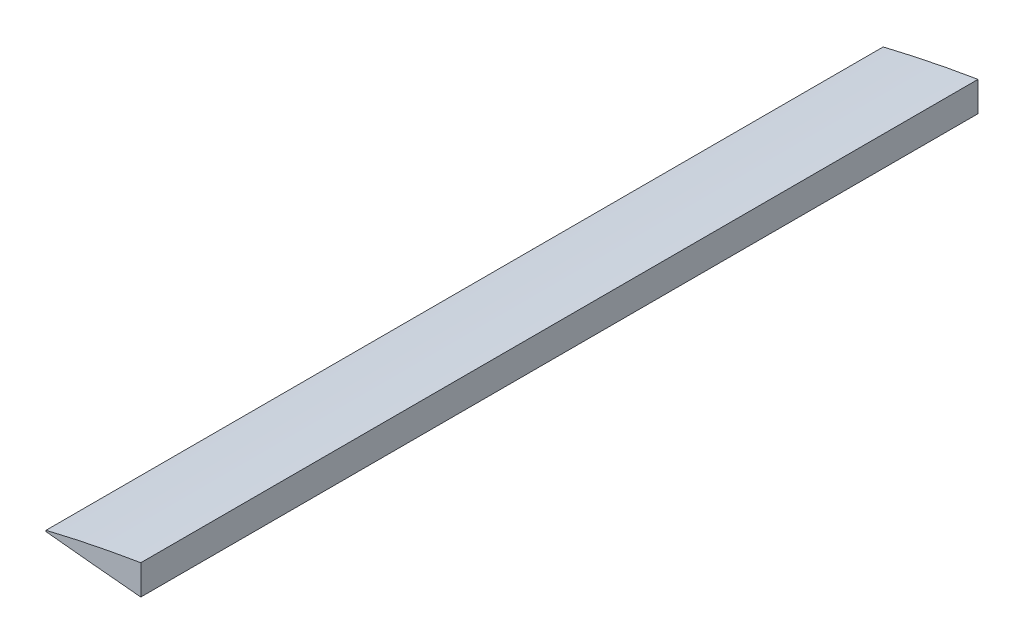
ISO-10303-21;
HEADER;
FILE_DESCRIPTION(('STEP AP214'),'2;1');
FILE_NAME('part.step','',(''),(''),'','','');
FILE_SCHEMA(('AUTOMOTIVE_DESIGN { 1 0 10303 214 1 1 1 1 }'));
ENDSEC;
DATA;
#1=APPLICATION_CONTEXT('core data for automotive mechanical design processes');
#2=APPLICATION_PROTOCOL_DEFINITION('international standard','automotive_design',2000,#1);
#3=PRODUCT_CONTEXT('',#1,'mechanical');
#4=PRODUCT('Part','Part','',(#3));
#5=PRODUCT_RELATED_PRODUCT_CATEGORY('part','',(#4));
#6=PRODUCT_DEFINITION_FORMATION('','',#4);
#7=PRODUCT_DEFINITION_CONTEXT('part definition',#1,'design');
#8=PRODUCT_DEFINITION('design','',#6,#7);
#9=PRODUCT_DEFINITION_SHAPE('','',#8);
#10=(LENGTH_UNIT() NAMED_UNIT(*) SI_UNIT(.MILLI.,.METRE.));
#11=(NAMED_UNIT(*) PLANE_ANGLE_UNIT() SI_UNIT($,.RADIAN.));
#12=(NAMED_UNIT(*) SI_UNIT($,.STERADIAN.) SOLID_ANGLE_UNIT());
#13=UNCERTAINTY_MEASURE_WITH_UNIT(LENGTH_MEASURE(1.E-05),#10,'distance_accuracy_value','');
#14=(GEOMETRIC_REPRESENTATION_CONTEXT(3) GLOBAL_UNCERTAINTY_ASSIGNED_CONTEXT((#13)) GLOBAL_UNIT_ASSIGNED_CONTEXT((#10,
#11,#12)) REPRESENTATION_CONTEXT('',''));
#15=CARTESIAN_POINT('',(0.,0.,0.));
#16=DIRECTION('',(0.,0.,1.));
#17=DIRECTION('',(1.,0.,0.));
#18=AXIS2_PLACEMENT_3D('',#15,#16,#17);
#19=CARTESIAN_POINT('',(-197.26698,14.5455563842117,612.));
#20=CARTESIAN_POINT('',(-199.291263309449,14.2098235608923,612.));
#21=CARTESIAN_POINT('',(-204.216747598756,13.3929187635522,612.));
#22=CARTESIAN_POINT('',(-211.867868305819,12.0299445619646,612.));
#23=CARTESIAN_POINT('',(-220.046716751411,10.5108577650669,612.));
#24=CARTESIAN_POINT('',(-227.684960433517,9.02419088101299,612.));
#25=CARTESIAN_POINT('',(-234.737637436739,7.59533686084731,612.));
#26=CARTESIAN_POINT('',(-241.162806840911,6.24495861444983,612.));
#27=CARTESIAN_POINT('',(-246.922671775962,4.99420998366507,612.));
#28=CARTESIAN_POINT('',(-251.983535286983,3.86307494473272,612.));
#29=CARTESIAN_POINT('',(-256.315994171342,2.87026933874093,612.));
#30=CARTESIAN_POINT('',(-259.895031114643,2.03269567934803,612.));
#31=CARTESIAN_POINT('',(-262.700108492801,1.3650391167586,612.));
#32=CARTESIAN_POINT('',(-264.715189951494,0.879184388013478,612.));
#33=CARTESIAN_POINT('',(-265.919534870809,0.58638033068329,612.));
#34=CARTESIAN_POINT('',(-266.45091941256,0.456553449180884,612.));
#35=CARTESIAN_POINT('',(-266.577,0.425749674890788,612.));
#36=B_SPLINE_CURVE_WITH_KNOTS('',3,(#19,#20,#21,#22,#23,#24,#25,#26,#27,#28,#29,#30,#31,#32,#33,
#34,#35),.UNSPECIFIED.,.F.,.F.,(4,1,1,1,1,1,1,1,1,1,1,1,1,1,4),(0.,0.0870070051452903,
0.21170536500617,0.329527112719374,0.439740644540536,0.541660709078569,0.634652346186561,
0.718134668905483,0.791584505134145,0.854539888493236,0.906603358473801,0.947445002011978,
0.976805146454737,0.994496601743554,1.),.UNSPECIFIED.);
#37=DIRECTION('',(0.,0.,-1.));
#38=VECTOR('',#37,1.);
#39=SURFACE_OF_LINEAR_EXTRUSION('',#36,#38);
#40=CARTESIAN_POINT('',(-197.26698,14.5455563842117,0.));
#41=CARTESIAN_POINT('',(-199.291263309449,14.2098235608923,0.));
#42=CARTESIAN_POINT('',(-204.216747598756,13.3929187635522,0.));
#43=CARTESIAN_POINT('',(-211.867868305819,12.0299445619646,0.));
#44=CARTESIAN_POINT('',(-220.046716751411,10.5108577650669,0.));
#45=CARTESIAN_POINT('',(-227.684960433517,9.02419088101299,0.));
#46=CARTESIAN_POINT('',(-234.737637436739,7.59533686084731,0.));
#47=CARTESIAN_POINT('',(-241.162806840911,6.24495861444983,0.));
#48=CARTESIAN_POINT('',(-246.922671775962,4.99420998366507,0.));
#49=CARTESIAN_POINT('',(-251.983535286983,3.86307494473272,0.));
#50=CARTESIAN_POINT('',(-256.315994171342,2.87026933874093,0.));
#51=CARTESIAN_POINT('',(-259.895031114643,2.03269567934803,0.));
#52=CARTESIAN_POINT('',(-262.700108492801,1.3650391167586,0.));
#53=CARTESIAN_POINT('',(-264.715189951494,0.879184388013478,0.));
#54=CARTESIAN_POINT('',(-265.919534870809,0.58638033068329,0.));
#55=CARTESIAN_POINT('',(-266.45091941256,0.456553449180884,0.));
#56=CARTESIAN_POINT('',(-266.577,0.425749674890788,0.));
#57=B_SPLINE_CURVE_WITH_KNOTS('',3,(#40,#41,#42,#43,#44,#45,#46,#47,#48,#49,#50,#51,#52,#53,#54,
#55,#56),.UNSPECIFIED.,.F.,.F.,(4,1,1,1,1,1,1,1,1,1,1,1,1,1,4),(0.,0.0870070051452903,
0.21170536500617,0.329527112719374,0.439740644540536,0.541660709078569,0.634652346186561,
0.718134668905483,0.791584505134145,0.854539888493236,0.906603358473801,0.947445002011978,
0.976805146454737,0.994496601743554,1.),.UNSPECIFIED.);
#58=CARTESIAN_POINT('',(-197.26698,14.5455563842117,0.));
#59=VERTEX_POINT('',#58);
#60=CARTESIAN_POINT('',(-266.577,0.425749674890788,0.));
#61=VERTEX_POINT('',#60);
#62=EDGE_CURVE('E134',#59,#61,#57,.T.);
#63=ORIENTED_EDGE('',*,*,#62,.T.);
#64=DIRECTION('',(0.,0.,-1.));
#65=VECTOR('',#64,1.);
#66=CARTESIAN_POINT('',(-266.577,0.425749674890788,612.));
#67=LINE('',#66,#65);
#68=CARTESIAN_POINT('',(-266.577,0.425749674890788,612.));
#69=VERTEX_POINT('',#68);
#70=EDGE_CURVE('E184',#69,#61,#67,.T.);
#71=ORIENTED_EDGE('',*,*,#70,.F.);
#72=CARTESIAN_POINT('',(-197.26698,14.5455563842117,612.));
#73=VERTEX_POINT('',#72);
#74=EDGE_CURVE('E147',#73,#69,#36,.T.);
#75=ORIENTED_EDGE('',*,*,#74,.F.);
#76=DIRECTION('',(0.,0.,-1.));
#77=VECTOR('',#76,1.);
#78=CARTESIAN_POINT('',(-197.26698,14.5455563842117,612.));
#79=LINE('',#78,#77);
#80=EDGE_CURVE('E204',#73,#59,#79,.T.);
#81=ORIENTED_EDGE('',*,*,#80,.T.);
#82=EDGE_LOOP('',(#63,#71,#75,#81));
#83=FACE_BOUND('',#82,.T.);
#84=ADVANCED_FACE('F39',(#83),#39,.F.);
#85=CARTESIAN_POINT('',(-266.577,0.425749674890788,612.));
#86=DIRECTION('',(1.,0.,0.));
#87=DIRECTION('',(0.,0.,-1.));
#88=AXIS2_PLACEMENT_3D('',#85,#86,#87);
#89=PLANE('',#88);
#90=DIRECTION('',(0.,-1.,0.));
#91=VECTOR('',#90,1.);
#92=CARTESIAN_POINT('',(-266.577,0.425749674890788,0.));
#93=LINE('',#92,#91);
#94=CARTESIAN_POINT('',(-266.577,-0.41892885409085,0.));
#95=VERTEX_POINT('',#94);
#96=EDGE_CURVE('E179',#61,#95,#93,.T.);
#97=ORIENTED_EDGE('',*,*,#96,.T.);
#98=DIRECTION('',(0.,0.,-1.));
#99=VECTOR('',#98,1.);
#100=CARTESIAN_POINT('',(-266.577,-0.41892885409085,612.));
#101=LINE('',#100,#99);
#102=CARTESIAN_POINT('',(-266.577,-0.41892885409085,612.));
#103=VERTEX_POINT('',#102);
#104=EDGE_CURVE('E181',#103,#95,#101,.T.);
#105=ORIENTED_EDGE('',*,*,#104,.F.);
#106=DIRECTION('',(0.,-1.,0.));
#107=VECTOR('',#106,1.);
#108=CARTESIAN_POINT('',(-266.577,0.425749674890788,612.));
#109=LINE('',#108,#107);
#110=EDGE_CURVE('E94',#69,#103,#109,.T.);
#111=ORIENTED_EDGE('',*,*,#110,.F.);
#112=ORIENTED_EDGE('',*,*,#70,.T.);
#113=EDGE_LOOP('',(#97,#105,#111,#112));
#114=FACE_BOUND('',#113,.T.);
#115=ADVANCED_FACE('F170',(#114),#89,.F.);
#116=CARTESIAN_POINT('',(-266.577,-0.41892885409085,612.));
#117=CARTESIAN_POINT('',(-266.567688700725,-0.418895711428767,612.));
#118=CARTESIAN_POINT('',(-266.419029815931,-0.418366574619933,612.));
#119=CARTESIAN_POINT('',(-265.858416095577,-0.512805200817322,612.));
#120=CARTESIAN_POINT('',(-264.615468630259,-0.612861211389642,612.));
#121=CARTESIAN_POINT('',(-262.556904408314,-0.849913682994218,612.));
#122=CARTESIAN_POINT('',(-259.69222092313,-1.14357574442184,612.));
#123=CARTESIAN_POINT('',(-256.042317783404,-1.52735930086127,612.));
#124=CARTESIAN_POINT('',(-251.630355083086,-1.98099836309341,612.));
#125=CARTESIAN_POINT('',(-246.485492990788,-2.50472176150919,612.));
#126=CARTESIAN_POINT('',(-240.641108588964,-3.09072516045395,612.));
#127=CARTESIAN_POINT('',(-234.135070336197,-3.73362628466857,612.));
#128=CARTESIAN_POINT('',(-227.009246774642,-4.42698979177177,612.));
#129=CARTESIAN_POINT('',(-219.309277241564,-5.16475841349066,612.));
#130=CARTESIAN_POINT('',(-211.084107985415,-5.93956686196069,612.));
#131=CARTESIAN_POINT('',(-203.67843919876,-6.62767429473458,612.));
#132=CARTESIAN_POINT('',(-199.019685081769,-7.05001759121365,612.));
#133=CARTESIAN_POINT('',(-197.26698,-7.20891055345223,612.));
#134=B_SPLINE_CURVE_WITH_KNOTS('',3,(#116,#117,#118,#119,#120,#121,#122,#123,#124,#125,#126,
#127,#128,#129,#130,#131,#132,#133),.UNSPECIFIED.,.F.,.F.,(4,1,1,1,1,1,1,1,1,1,1,1,1,1,1,4),(0.,
0.00040102700423772,0.00640256804801376,0.0243667405419054,0.0541726551316404,
0.0956203448841406,0.148432949269865,0.212259606924723,0.286678920603445,0.371202853061501,
0.465280924763119,0.568304609739684,0.67961185947699,0.798491720853711,0.924189047970984,1.),.UNSPECIFIED.);
#135=DIRECTION('',(0.,0.,-1.));
#136=VECTOR('',#135,1.);
#137=SURFACE_OF_LINEAR_EXTRUSION('',#134,#136);
#138=DIRECTION('',(0.,0.,-1.));
#139=VECTOR('',#138,1.);
#140=CARTESIAN_POINT('',(-220.432,-5.05582594113558,612.));
#141=LINE('',#140,#139);
#142=CARTESIAN_POINT('',(-220.432,-5.05582594161143,96.8999999999999));
#143=VERTEX_POINT('',#142);
#144=CARTESIAN_POINT('',(-220.431999995003,-5.05582594161143,83.8999999999999));
#145=VERTEX_POINT('',#144);
#146=EDGE_CURVE('E49',#143,#145,#141,.T.);
#147=ORIENTED_EDGE('',*,*,#146,.F.);
#148=CARTESIAN_POINT('',(-266.577,-0.41892885409085,96.9));
#149=CARTESIAN_POINT('',(-266.567688700725,-0.418895711428767,96.9));
#150=CARTESIAN_POINT('',(-266.419029815931,-0.418366574619933,96.9));
#151=CARTESIAN_POINT('',(-265.858416095577,-0.512805200817322,96.9));
#152=CARTESIAN_POINT('',(-264.615468630259,-0.612861211389642,96.9));
#153=CARTESIAN_POINT('',(-262.556904408314,-0.849913682994218,96.9));
#154=CARTESIAN_POINT('',(-259.69222092313,-1.14357574442184,96.9));
#155=CARTESIAN_POINT('',(-256.042317783404,-1.52735930086127,96.9));
#156=CARTESIAN_POINT('',(-251.630355083086,-1.98099836309341,96.9));
#157=CARTESIAN_POINT('',(-246.485492990788,-2.50472176150919,96.9));
#158=CARTESIAN_POINT('',(-240.641108588964,-3.09072516045395,96.9));
#159=CARTESIAN_POINT('',(-234.135070336197,-3.73362628466857,96.9));
#160=CARTESIAN_POINT('',(-227.009246774642,-4.42698979177177,96.9));
#161=CARTESIAN_POINT('',(-219.309277241564,-5.16475841349066,96.9));
#162=CARTESIAN_POINT('',(-211.084107985415,-5.93956686196069,96.9));
#163=CARTESIAN_POINT('',(-203.67843919876,-6.62767429473458,96.9));
#164=CARTESIAN_POINT('',(-199.019685081769,-7.05001759121365,96.9));
#165=CARTESIAN_POINT('',(-197.26698,-7.20891055345223,96.9));
#166=B_SPLINE_CURVE_WITH_KNOTS('',3,(#148,#149,#150,#151,#152,#153,#154,#155,#156,#157,#158,
#159,#160,#161,#162,#163,#164,#165),.UNSPECIFIED.,.F.,.F.,(4,1,1,1,1,1,1,1,1,1,1,1,1,1,1,4),(0.,
0.00040102700423772,0.00640256804801376,0.0243667405419054,0.0541726551316404,
0.0956203448841406,0.148432949269865,0.212259606924723,0.286678920603445,0.371202853061501,
0.465280924763119,0.568304609739684,0.67961185947699,0.798491720853711,0.924189047970984,1.),.UNSPECIFIED.);
#167=CARTESIAN_POINT('',(-199.432,-7.012534803575,96.8999999999999));
#168=VERTEX_POINT('',#167);
#169=EDGE_CURVE('E11',#143,#168,#166,.T.);
#170=ORIENTED_EDGE('',*,*,#169,.T.);
#171=DIRECTION('',(0.,0.,-1.));
#172=VECTOR('',#171,1.);
#173=CARTESIAN_POINT('',(-199.432,-7.012534803575,612.));
#174=LINE('',#173,#172);
#175=CARTESIAN_POINT('',(-199.432,-7.012534803575,83.8999999999999));
#176=VERTEX_POINT('',#175);
#177=EDGE_CURVE('E123',#176,#168,#174,.F.);
#178=ORIENTED_EDGE('',*,*,#177,.F.);
#179=CARTESIAN_POINT('',(-266.577,-0.41892885409085,83.8999999999999));
#180=CARTESIAN_POINT('',(-266.567688700725,-0.418895711428767,83.8999999999999));
#181=CARTESIAN_POINT('',(-266.419029815931,-0.418366574619933,83.8999999999999));
#182=CARTESIAN_POINT('',(-265.858416095577,-0.512805200817322,83.8999999999999));
#183=CARTESIAN_POINT('',(-264.615468630259,-0.612861211389642,83.8999999999999));
#184=CARTESIAN_POINT('',(-262.556904408314,-0.849913682994218,83.8999999999999));
#185=CARTESIAN_POINT('',(-259.69222092313,-1.14357574442184,83.8999999999999));
#186=CARTESIAN_POINT('',(-256.042317783404,-1.52735930086127,83.8999999999999));
#187=CARTESIAN_POINT('',(-251.630355083086,-1.98099836309341,83.8999999999999));
#188=CARTESIAN_POINT('',(-246.485492990788,-2.50472176150919,83.8999999999999));
#189=CARTESIAN_POINT('',(-240.641108588964,-3.09072516045395,83.8999999999999));
#190=CARTESIAN_POINT('',(-234.135070336197,-3.73362628466857,83.8999999999999));
#191=CARTESIAN_POINT('',(-227.009246774642,-4.42698979177177,83.8999999999999));
#192=CARTESIAN_POINT('',(-219.309277241564,-5.16475841349066,83.8999999999999));
#193=CARTESIAN_POINT('',(-211.084107985415,-5.93956686196069,83.8999999999999));
#194=CARTESIAN_POINT('',(-203.67843919876,-6.62767429473458,83.8999999999999));
#195=CARTESIAN_POINT('',(-199.019685081769,-7.05001759121365,83.8999999999999));
#196=CARTESIAN_POINT('',(-197.26698,-7.20891055345223,83.8999999999999));
#197=B_SPLINE_CURVE_WITH_KNOTS('',3,(#179,#180,#181,#182,#183,#184,#185,#186,#187,#188,#189,
#190,#191,#192,#193,#194,#195,#196),.UNSPECIFIED.,.F.,.F.,(4,1,1,1,1,1,1,1,1,1,1,1,1,1,1,4),(0.,
0.00040102700423772,0.00640256804801376,0.0243667405419054,0.0541726551316404,
0.0956203448841406,0.148432949269865,0.212259606924723,0.286678920603445,0.371202853061501,
0.465280924763119,0.568304609739684,0.67961185947699,0.798491720853711,0.924189047970984,1.),.UNSPECIFIED.);
#198=EDGE_CURVE('E208',#145,#176,#197,.T.);
#199=ORIENTED_EDGE('',*,*,#198,.F.);
#200=EDGE_LOOP('',(#147,#170,#178,#199));
#201=FACE_BOUND('',#200,.T.);
#202=CARTESIAN_POINT('',(-266.577,-0.41892885409085,0.));
#203=CARTESIAN_POINT('',(-266.567688700725,-0.418895711428767,0.));
#204=CARTESIAN_POINT('',(-266.419029815931,-0.418366574619933,0.));
#205=CARTESIAN_POINT('',(-265.858416095577,-0.512805200817322,0.));
#206=CARTESIAN_POINT('',(-264.615468630259,-0.612861211389642,0.));
#207=CARTESIAN_POINT('',(-262.556904408314,-0.849913682994218,0.));
#208=CARTESIAN_POINT('',(-259.69222092313,-1.14357574442184,0.));
#209=CARTESIAN_POINT('',(-256.042317783404,-1.52735930086127,0.));
#210=CARTESIAN_POINT('',(-251.630355083086,-1.98099836309341,0.));
#211=CARTESIAN_POINT('',(-246.485492990788,-2.50472176150919,0.));
#212=CARTESIAN_POINT('',(-240.641108588964,-3.09072516045395,0.));
#213=CARTESIAN_POINT('',(-234.135070336197,-3.73362628466857,0.));
#214=CARTESIAN_POINT('',(-227.009246774642,-4.42698979177177,0.));
#215=CARTESIAN_POINT('',(-219.309277241564,-5.16475841349066,0.));
#216=CARTESIAN_POINT('',(-211.084107985415,-5.93956686196069,0.));
#217=CARTESIAN_POINT('',(-203.67843919876,-6.62767429473458,0.));
#218=CARTESIAN_POINT('',(-199.019685081769,-7.05001759121365,0.));
#219=CARTESIAN_POINT('',(-197.26698,-7.20891055345223,0.));
#220=B_SPLINE_CURVE_WITH_KNOTS('',3,(#202,#203,#204,#205,#206,#207,#208,#209,#210,#211,#212,
#213,#214,#215,#216,#217,#218,#219),.UNSPECIFIED.,.F.,.F.,(4,1,1,1,1,1,1,1,1,1,1,1,1,1,1,4),(0.,
0.00040102700423772,0.00640256804801376,0.0243667405419054,0.0541726551316404,
0.0956203448841406,0.148432949269865,0.212259606924723,0.286678920603445,0.371202853061501,
0.465280924763119,0.568304609739684,0.67961185947699,0.798491720853711,0.924189047970984,1.),.UNSPECIFIED.);
#221=CARTESIAN_POINT('',(-197.26698,-7.20891055345223,0.));
#222=VERTEX_POINT('',#221);
#223=EDGE_CURVE('E189',#95,#222,#220,.T.);
#224=ORIENTED_EDGE('',*,*,#223,.T.);
#225=DIRECTION('',(0.,0.,-1.));
#226=VECTOR('',#225,1.);
#227=CARTESIAN_POINT('',(-197.26698,-7.20891055345223,612.));
#228=LINE('',#227,#226);
#229=CARTESIAN_POINT('',(-197.26698,-7.20891055345223,612.));
#230=VERTEX_POINT('',#229);
#231=EDGE_CURVE('E193',#230,#222,#228,.T.);
#232=ORIENTED_EDGE('',*,*,#231,.F.);
#233=EDGE_CURVE('E156',#103,#230,#134,.T.);
#234=ORIENTED_EDGE('',*,*,#233,.F.);
#235=ORIENTED_EDGE('',*,*,#104,.T.);
#236=EDGE_LOOP('',(#224,#232,#234,#235));
#237=FACE_BOUND('',#236,.T.);
#238=ADVANCED_FACE('F166',(#201,#237),#137,.F.);
#239=CARTESIAN_POINT('',(-197.26698,14.5455563842117,612.));
#240=DIRECTION('',(-1.,0.,0.));
#241=DIRECTION('',(0.,0.,1.));
#242=AXIS2_PLACEMENT_3D('',#239,#240,#241);
#243=PLANE('',#242);
#244=DIRECTION('',(0.,1.,0.));
#245=VECTOR('',#244,1.);
#246=CARTESIAN_POINT('',(-197.26698,14.5455563842117,0.));
#247=LINE('',#246,#245);
#248=EDGE_CURVE('E86',#222,#59,#247,.T.);
#249=ORIENTED_EDGE('',*,*,#248,.T.);
#250=ORIENTED_EDGE('',*,*,#80,.F.);
#251=DIRECTION('',(0.,1.,0.));
#252=VECTOR('',#251,1.);
#253=CARTESIAN_POINT('',(-197.26698,14.5455563842117,612.));
#254=LINE('',#253,#252);
#255=EDGE_CURVE('E65',#230,#73,#254,.T.);
#256=ORIENTED_EDGE('',*,*,#255,.F.);
#257=ORIENTED_EDGE('',*,*,#231,.T.);
#258=EDGE_LOOP('',(#249,#250,#256,#257));
#259=FACE_BOUND('',#258,.T.);
#260=ADVANCED_FACE('F169',(#259),#243,.F.);
#261=CARTESIAN_POINT('',(-232.054668049981,8.13635792978354,612.));
#262=DIRECTION('',(0.,0.,-1.));
#263=DIRECTION('',(-1.,0.,0.));
#264=AXIS2_PLACEMENT_3D('',#261,#262,#263);
#265=PLANE('',#264);
#266=ORIENTED_EDGE('',*,*,#74,.T.);
#267=ORIENTED_EDGE('',*,*,#110,.T.);
#268=ORIENTED_EDGE('',*,*,#233,.T.);
#269=ORIENTED_EDGE('',*,*,#255,.T.);
#270=EDGE_LOOP('',(#266,#267,#268,#269));
#271=FACE_BOUND('',#270,.T.);
#272=ADVANCED_FACE('F233',(#271),#265,.F.);
#273=CARTESIAN_POINT('',(-232.054668049981,8.13635792978354,0.));
#274=DIRECTION('',(0.,0.,-1.));
#275=DIRECTION('',(-1.,0.,0.));
#276=AXIS2_PLACEMENT_3D('',#273,#274,#275);
#277=PLANE('',#276);
#278=ORIENTED_EDGE('',*,*,#62,.F.);
#279=ORIENTED_EDGE('',*,*,#248,.F.);
#280=ORIENTED_EDGE('',*,*,#223,.F.);
#281=ORIENTED_EDGE('',*,*,#96,.F.);
#282=EDGE_LOOP('',(#278,#279,#280,#281));
#283=FACE_BOUND('',#282,.T.);
#284=ADVANCED_FACE('F195',(#283),#277,.T.);
#285=CARTESIAN_POINT('',(-220.432,3.723,96.8999999999999));
#286=DIRECTION('',(1.,0.,0.));
#287=DIRECTION('',(0.,0.,-1.));
#288=AXIS2_PLACEMENT_3D('',#285,#286,#287);
#289=PLANE('',#288);
#290=ORIENTED_EDGE('',*,*,#146,.T.);
#291=DIRECTION('',(0.,-1.,0.));
#292=VECTOR('',#291,1.);
#293=CARTESIAN_POINT('',(-220.432,3.723,83.8999999999999));
#294=LINE('',#293,#292);
#295=CARTESIAN_POINT('',(-220.432,3.723,83.8999999999999));
#296=VERTEX_POINT('',#295);
#297=EDGE_CURVE('E56',#296,#145,#294,.T.);
#298=ORIENTED_EDGE('',*,*,#297,.F.);
#299=DIRECTION('',(0.,0.,-1.));
#300=VECTOR('',#299,1.);
#301=CARTESIAN_POINT('',(-220.432,3.723,96.8999999999999));
#302=LINE('',#301,#300);
#303=CARTESIAN_POINT('',(-220.432,3.723,96.8999999999999));
#304=VERTEX_POINT('',#303);
#305=EDGE_CURVE('E135',#304,#296,#302,.T.);
#306=ORIENTED_EDGE('',*,*,#305,.F.);
#307=DIRECTION('',(0.,-1.,0.));
#308=VECTOR('',#307,1.);
#309=CARTESIAN_POINT('',(-220.432,3.723,96.8999999999999));
#310=LINE('',#309,#308);
#311=EDGE_CURVE('E127',#304,#143,#310,.T.);
#312=ORIENTED_EDGE('',*,*,#311,.T.);
#313=EDGE_LOOP('',(#290,#298,#306,#312));
#314=FACE_BOUND('',#313,.T.);
#315=ADVANCED_FACE('F218',(#314),#289,.T.);
#316=CARTESIAN_POINT('',(-199.432,-7.777,96.8999999999999));
#317=DIRECTION('',(-1.,0.,0.));
#318=DIRECTION('',(0.,0.,1.));
#319=AXIS2_PLACEMENT_3D('',#316,#317,#318);
#320=PLANE('',#319);
#321=ORIENTED_EDGE('',*,*,#177,.T.);
#322=DIRECTION('',(0.,1.,0.));
#323=VECTOR('',#322,1.);
#324=CARTESIAN_POINT('',(-199.432,-7.777,96.8999999999999));
#325=LINE('',#324,#323);
#326=CARTESIAN_POINT('',(-199.432,3.723,96.8999999999999));
#327=VERTEX_POINT('',#326);
#328=EDGE_CURVE('E116',#168,#327,#325,.T.);
#329=ORIENTED_EDGE('',*,*,#328,.T.);
#330=DIRECTION('',(0.,0.,-1.));
#331=VECTOR('',#330,1.);
#332=CARTESIAN_POINT('',(-199.432,3.723,96.8999999999999));
#333=LINE('',#332,#331);
#334=CARTESIAN_POINT('',(-199.432,3.723,83.8999999999999));
#335=VERTEX_POINT('',#334);
#336=EDGE_CURVE('E120',#327,#335,#333,.T.);
#337=ORIENTED_EDGE('',*,*,#336,.T.);
#338=DIRECTION('',(0.,1.,0.));
#339=VECTOR('',#338,1.);
#340=CARTESIAN_POINT('',(-199.432,-7.777,83.8999999999999));
#341=LINE('',#340,#339);
#342=EDGE_CURVE('E145',#176,#335,#341,.T.);
#343=ORIENTED_EDGE('',*,*,#342,.F.);
#344=EDGE_LOOP('',(#321,#329,#337,#343));
#345=FACE_BOUND('',#344,.T.);
#346=ADVANCED_FACE('F118',(#345),#320,.T.);
#347=CARTESIAN_POINT('',(0.,0.,96.8999999999999));
#348=DIRECTION('',(0.,0.,1.));
#349=DIRECTION('',(1.,0.,0.));
#350=AXIS2_PLACEMENT_3D('',#347,#348,#349);
#351=PLANE('',#350);
#352=ORIENTED_EDGE('',*,*,#311,.F.);
#353=DIRECTION('',(-1.,0.,0.));
#354=VECTOR('',#353,1.);
#355=CARTESIAN_POINT('',(-199.432,3.723,96.8999999999999));
#356=LINE('',#355,#354);
#357=EDGE_CURVE('E126',#327,#304,#356,.T.);
#358=ORIENTED_EDGE('',*,*,#357,.F.);
#359=ORIENTED_EDGE('',*,*,#328,.F.);
#360=ORIENTED_EDGE('',*,*,#169,.F.);
#361=EDGE_LOOP('',(#352,#358,#359,#360));
#362=FACE_BOUND('',#361,.T.);
#363=ADVANCED_FACE('F138',(#362),#351,.F.);
#364=CARTESIAN_POINT('',(0.,0.,83.8999999999999));
#365=DIRECTION('',(0.,0.,1.));
#366=DIRECTION('',(1.,0.,0.));
#367=AXIS2_PLACEMENT_3D('',#364,#365,#366);
#368=PLANE('',#367);
#369=ORIENTED_EDGE('',*,*,#198,.T.);
#370=ORIENTED_EDGE('',*,*,#342,.T.);
#371=DIRECTION('',(-1.,0.,0.));
#372=VECTOR('',#371,1.);
#373=CARTESIAN_POINT('',(-199.432,3.723,83.8999999999999));
#374=LINE('',#373,#372);
#375=EDGE_CURVE('E133',#335,#296,#374,.T.);
#376=ORIENTED_EDGE('',*,*,#375,.T.);
#377=ORIENTED_EDGE('',*,*,#297,.T.);
#378=EDGE_LOOP('',(#369,#370,#376,#377));
#379=FACE_BOUND('',#378,.T.);
#380=ADVANCED_FACE('F219',(#379),#368,.T.);
#381=CARTESIAN_POINT('',(-199.432,3.723,96.8999999999999));
#382=DIRECTION('',(0.,-1.,0.));
#383=DIRECTION('',(0.,0.,-1.));
#384=AXIS2_PLACEMENT_3D('',#381,#382,#383);
#385=PLANE('',#384);
#386=ORIENTED_EDGE('',*,*,#375,.F.);
#387=ORIENTED_EDGE('',*,*,#336,.F.);
#388=ORIENTED_EDGE('',*,*,#357,.T.);
#389=ORIENTED_EDGE('',*,*,#305,.T.);
#390=EDGE_LOOP('',(#386,#387,#388,#389));
#391=FACE_BOUND('',#390,.T.);
#392=ADVANCED_FACE('F130',(#391),#385,.T.);
#393=CLOSED_SHELL('',(#84,#115,#238,#260,#272,#284,#315,#346,#363,#380,#392));
#394=MANIFOLD_SOLID_BREP('B2',#393);
#395=ADVANCED_BREP_SHAPE_REPRESENTATION('',(#18,#394),#14);
#396=SHAPE_DEFINITION_REPRESENTATION(#9,#395);
ENDSEC;
END-ISO-10303-21;
